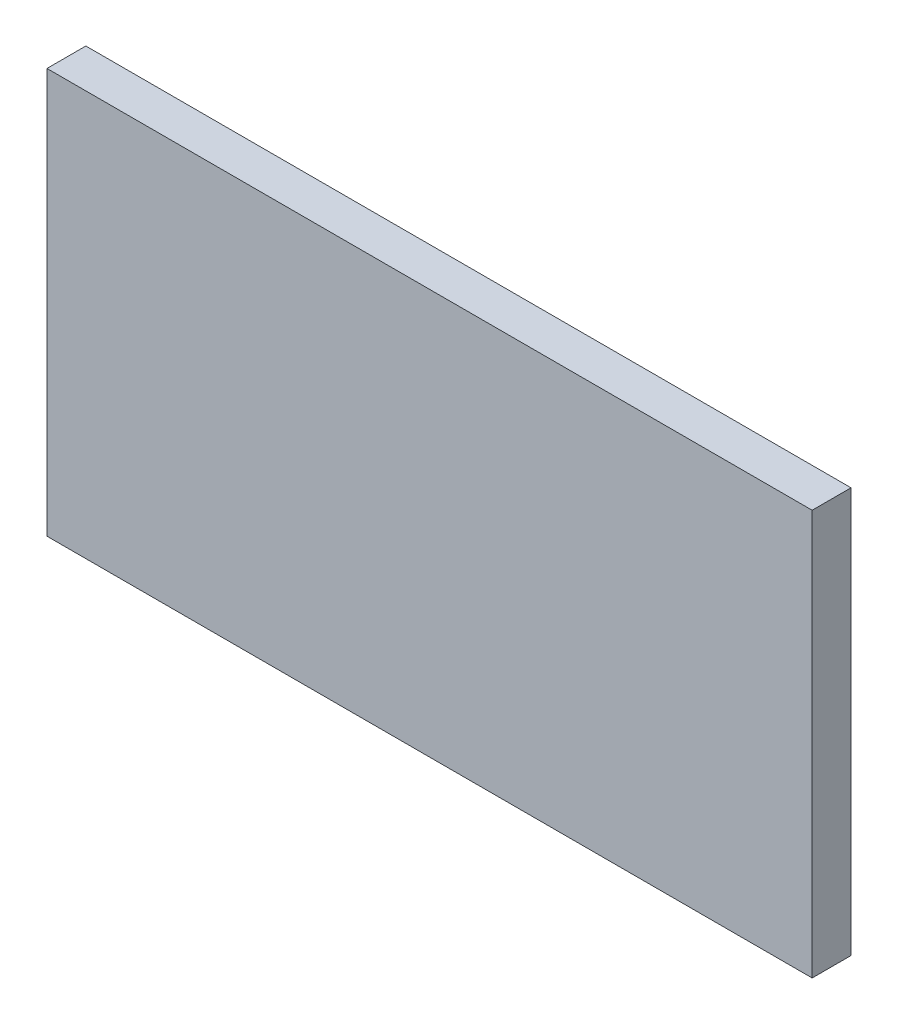
ISO-10303-21;
HEADER;
FILE_DESCRIPTION(('STEP AP214'),'2;1');
FILE_NAME('part.step','',(''),(''),'','','');
FILE_SCHEMA(('AUTOMOTIVE_DESIGN { 1 0 10303 214 1 1 1 1 }'));
ENDSEC;
DATA;
#1=APPLICATION_CONTEXT('core data for automotive mechanical design processes');
#2=APPLICATION_PROTOCOL_DEFINITION('international standard','automotive_design',2000,#1);
#3=PRODUCT_CONTEXT('',#1,'mechanical');
#4=PRODUCT('Part','Part','',(#3));
#5=PRODUCT_RELATED_PRODUCT_CATEGORY('part','',(#4));
#6=PRODUCT_DEFINITION_FORMATION('','',#4);
#7=PRODUCT_DEFINITION_CONTEXT('part definition',#1,'design');
#8=PRODUCT_DEFINITION('design','',#6,#7);
#9=PRODUCT_DEFINITION_SHAPE('','',#8);
#10=(LENGTH_UNIT() NAMED_UNIT(*) SI_UNIT(.MILLI.,.METRE.));
#11=(NAMED_UNIT(*) PLANE_ANGLE_UNIT() SI_UNIT($,.RADIAN.));
#12=(NAMED_UNIT(*) SI_UNIT($,.STERADIAN.) SOLID_ANGLE_UNIT());
#13=UNCERTAINTY_MEASURE_WITH_UNIT(LENGTH_MEASURE(1.E-05),#10,'distance_accuracy_value','');
#14=(GEOMETRIC_REPRESENTATION_CONTEXT(3) GLOBAL_UNCERTAINTY_ASSIGNED_CONTEXT((#13)) GLOBAL_UNIT_ASSIGNED_CONTEXT((#10,
#11,#12)) REPRESENTATION_CONTEXT('',''));
#15=CARTESIAN_POINT('',(0.,0.,0.));
#16=DIRECTION('',(0.,0.,1.));
#17=DIRECTION('',(1.,0.,0.));
#18=AXIS2_PLACEMENT_3D('',#15,#16,#17);
#19=CARTESIAN_POINT('',(0.,0.,19.));
#20=DIRECTION('',(1.,0.,0.));
#21=DIRECTION('',(0.,0.,-1.));
#22=AXIS2_PLACEMENT_3D('',#19,#20,#21);
#23=PLANE('',#22);
#24=DIRECTION('',(0.,-1.,0.));
#25=VECTOR('',#24,1.);
#26=CARTESIAN_POINT('',(0.,0.,0.));
#27=LINE('',#26,#25);
#28=CARTESIAN_POINT('',(0.,198.,0.));
#29=VERTEX_POINT('',#28);
#30=CARTESIAN_POINT('',(0.,0.,0.));
#31=VERTEX_POINT('',#30);
#32=EDGE_CURVE('E99',#29,#31,#27,.T.);
#33=ORIENTED_EDGE('',*,*,#32,.T.);
#34=DIRECTION('',(0.,0.,-1.));
#35=VECTOR('',#34,1.);
#36=CARTESIAN_POINT('',(0.,0.,19.));
#37=LINE('',#36,#35);
#38=CARTESIAN_POINT('',(0.,0.,19.));
#39=VERTEX_POINT('',#38);
#40=EDGE_CURVE('E11',#39,#31,#37,.T.);
#41=ORIENTED_EDGE('',*,*,#40,.F.);
#42=DIRECTION('',(0.,-1.,0.));
#43=VECTOR('',#42,1.);
#44=CARTESIAN_POINT('',(0.,0.,19.));
#45=LINE('',#44,#43);
#46=CARTESIAN_POINT('',(0.,198.,19.));
#47=VERTEX_POINT('',#46);
#48=EDGE_CURVE('E87',#47,#39,#45,.T.);
#49=ORIENTED_EDGE('',*,*,#48,.F.);
#50=DIRECTION('',(0.,0.,-1.));
#51=VECTOR('',#50,1.);
#52=CARTESIAN_POINT('',(0.,198.,19.));
#53=LINE('',#52,#51);
#54=EDGE_CURVE('E95',#47,#29,#53,.T.);
#55=ORIENTED_EDGE('',*,*,#54,.T.);
#56=EDGE_LOOP('',(#33,#41,#49,#55));
#57=FACE_BOUND('',#56,.T.);
#58=ADVANCED_FACE('F36',(#57),#23,.F.);
#59=CARTESIAN_POINT('',(0.,0.,19.));
#60=DIRECTION('',(0.,1.,0.));
#61=DIRECTION('',(0.,0.,1.));
#62=AXIS2_PLACEMENT_3D('',#59,#60,#61);
#63=PLANE('',#62);
#64=DIRECTION('',(1.,0.,0.));
#65=VECTOR('',#64,1.);
#66=CARTESIAN_POINT('',(0.,0.,0.));
#67=LINE('',#66,#65);
#68=CARTESIAN_POINT('',(374.,0.,0.));
#69=VERTEX_POINT('',#68);
#70=EDGE_CURVE('E91',#31,#69,#67,.T.);
#71=ORIENTED_EDGE('',*,*,#70,.T.);
#72=DIRECTION('',(0.,0.,-1.));
#73=VECTOR('',#72,1.);
#74=CARTESIAN_POINT('',(374.,0.,19.));
#75=LINE('',#74,#73);
#76=CARTESIAN_POINT('',(374.,0.,19.));
#77=VERTEX_POINT('',#76);
#78=EDGE_CURVE('E44',#77,#69,#75,.T.);
#79=ORIENTED_EDGE('',*,*,#78,.F.);
#80=DIRECTION('',(1.,0.,0.));
#81=VECTOR('',#80,1.);
#82=CARTESIAN_POINT('',(0.,0.,19.));
#83=LINE('',#82,#81);
#84=EDGE_CURVE('E82',#39,#77,#83,.T.);
#85=ORIENTED_EDGE('',*,*,#84,.F.);
#86=ORIENTED_EDGE('',*,*,#40,.T.);
#87=EDGE_LOOP('',(#71,#79,#85,#86));
#88=FACE_BOUND('',#87,.T.);
#89=ADVANCED_FACE('F90',(#88),#63,.F.);
#90=CARTESIAN_POINT('',(374.,0.,19.));
#91=DIRECTION('',(-1.,0.,0.));
#92=DIRECTION('',(0.,0.,1.));
#93=AXIS2_PLACEMENT_3D('',#90,#91,#92);
#94=PLANE('',#93);
#95=DIRECTION('',(0.,1.,0.));
#96=VECTOR('',#95,1.);
#97=CARTESIAN_POINT('',(374.,0.,0.));
#98=LINE('',#97,#96);
#99=CARTESIAN_POINT('',(374.,198.,0.));
#100=VERTEX_POINT('',#99);
#101=EDGE_CURVE('E69',#69,#100,#98,.T.);
#102=ORIENTED_EDGE('',*,*,#101,.T.);
#103=DIRECTION('',(0.,0.,-1.));
#104=VECTOR('',#103,1.);
#105=CARTESIAN_POINT('',(374.,198.,19.));
#106=LINE('',#105,#104);
#107=CARTESIAN_POINT('',(374.,198.,19.));
#108=VERTEX_POINT('',#107);
#109=EDGE_CURVE('E92',#108,#100,#106,.T.);
#110=ORIENTED_EDGE('',*,*,#109,.F.);
#111=DIRECTION('',(0.,1.,0.));
#112=VECTOR('',#111,1.);
#113=CARTESIAN_POINT('',(374.,0.,19.));
#114=LINE('',#113,#112);
#115=EDGE_CURVE('E85',#77,#108,#114,.T.);
#116=ORIENTED_EDGE('',*,*,#115,.F.);
#117=ORIENTED_EDGE('',*,*,#78,.T.);
#118=EDGE_LOOP('',(#102,#110,#116,#117));
#119=FACE_BOUND('',#118,.T.);
#120=ADVANCED_FACE('F93',(#119),#94,.F.);
#121=CARTESIAN_POINT('',(0.,198.,19.));
#122=DIRECTION('',(0.,-1.,0.));
#123=DIRECTION('',(0.,0.,-1.));
#124=AXIS2_PLACEMENT_3D('',#121,#122,#123);
#125=PLANE('',#124);
#126=DIRECTION('',(-1.,0.,0.));
#127=VECTOR('',#126,1.);
#128=CARTESIAN_POINT('',(0.,198.,0.));
#129=LINE('',#128,#127);
#130=EDGE_CURVE('E75',#100,#29,#129,.T.);
#131=ORIENTED_EDGE('',*,*,#130,.T.);
#132=ORIENTED_EDGE('',*,*,#54,.F.);
#133=DIRECTION('',(-1.,0.,0.));
#134=VECTOR('',#133,1.);
#135=CARTESIAN_POINT('',(0.,198.,19.));
#136=LINE('',#135,#134);
#137=EDGE_CURVE('E52',#108,#47,#136,.T.);
#138=ORIENTED_EDGE('',*,*,#137,.F.);
#139=ORIENTED_EDGE('',*,*,#109,.T.);
#140=EDGE_LOOP('',(#131,#132,#138,#139));
#141=FACE_BOUND('',#140,.T.);
#142=ADVANCED_FACE('F106',(#141),#125,.F.);
#143=CARTESIAN_POINT('',(0.,0.,19.));
#144=DIRECTION('',(0.,0.,-1.));
#145=DIRECTION('',(-1.,0.,0.));
#146=AXIS2_PLACEMENT_3D('',#143,#144,#145);
#147=PLANE('',#146);
#148=ORIENTED_EDGE('',*,*,#48,.T.);
#149=ORIENTED_EDGE('',*,*,#84,.T.);
#150=ORIENTED_EDGE('',*,*,#115,.T.);
#151=ORIENTED_EDGE('',*,*,#137,.T.);
#152=EDGE_LOOP('',(#148,#149,#150,#151));
#153=FACE_BOUND('',#152,.T.);
#154=ADVANCED_FACE('F83',(#153),#147,.F.);
#155=CARTESIAN_POINT('',(0.,0.,0.));
#156=DIRECTION('',(0.,0.,-1.));
#157=DIRECTION('',(-1.,0.,0.));
#158=AXIS2_PLACEMENT_3D('',#155,#156,#157);
#159=PLANE('',#158);
#160=ORIENTED_EDGE('',*,*,#32,.F.);
#161=ORIENTED_EDGE('',*,*,#130,.F.);
#162=ORIENTED_EDGE('',*,*,#101,.F.);
#163=ORIENTED_EDGE('',*,*,#70,.F.);
#164=EDGE_LOOP('',(#160,#161,#162,#163));
#165=FACE_BOUND('',#164,.T.);
#166=ADVANCED_FACE('F109',(#165),#159,.T.);
#167=CLOSED_SHELL('',(#58,#89,#120,#142,#154,#166));
#168=MANIFOLD_SOLID_BREP('B2',#167);
#169=ADVANCED_BREP_SHAPE_REPRESENTATION('',(#18,#168),#14);
#170=SHAPE_DEFINITION_REPRESENTATION(#9,#169);
ENDSEC;
END-ISO-10303-21;
